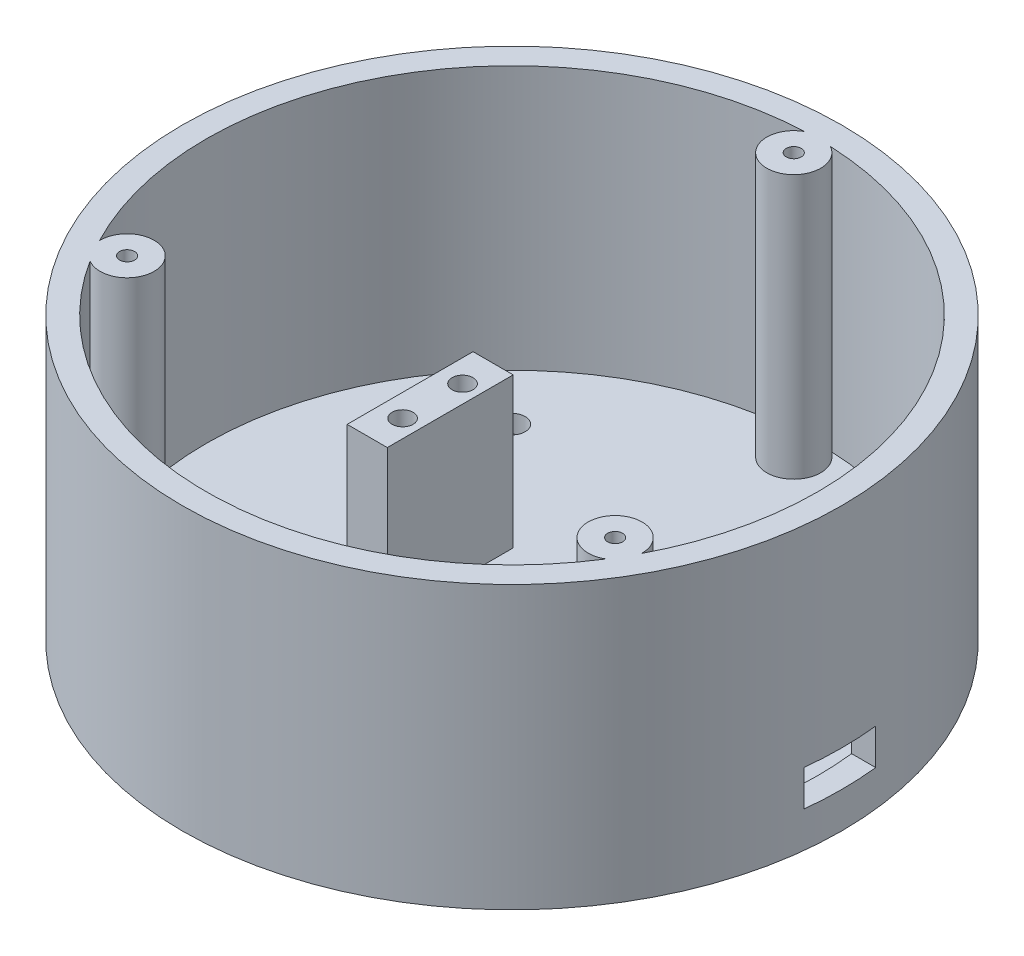
ISO-10303-21;
HEADER;
FILE_DESCRIPTION(('STEP AP214'),'2;1');
FILE_NAME('part.step','',(''),(''),'','','');
FILE_SCHEMA(('AUTOMOTIVE_DESIGN { 1 0 10303 214 1 1 1 1 }'));
ENDSEC;
DATA;
#1=APPLICATION_CONTEXT('core data for automotive mechanical design processes');
#2=APPLICATION_PROTOCOL_DEFINITION('international standard','automotive_design',2000,#1);
#3=PRODUCT_CONTEXT('',#1,'mechanical');
#4=PRODUCT('Part','Part','',(#3));
#5=PRODUCT_RELATED_PRODUCT_CATEGORY('part','',(#4));
#6=PRODUCT_DEFINITION_FORMATION('','',#4);
#7=PRODUCT_DEFINITION_CONTEXT('part definition',#1,'design');
#8=PRODUCT_DEFINITION('design','',#6,#7);
#9=PRODUCT_DEFINITION_SHAPE('','',#8);
#10=(LENGTH_UNIT() NAMED_UNIT(*) SI_UNIT(.MILLI.,.METRE.));
#11=(NAMED_UNIT(*) PLANE_ANGLE_UNIT() SI_UNIT($,.RADIAN.));
#12=(NAMED_UNIT(*) SI_UNIT($,.STERADIAN.) SOLID_ANGLE_UNIT());
#13=UNCERTAINTY_MEASURE_WITH_UNIT(LENGTH_MEASURE(1.E-05),#10,'distance_accuracy_value','');
#14=(GEOMETRIC_REPRESENTATION_CONTEXT(3) GLOBAL_UNCERTAINTY_ASSIGNED_CONTEXT((#13)) GLOBAL_UNIT_ASSIGNED_CONTEXT((#10,
#11,#12)) REPRESENTATION_CONTEXT('',''));
#15=CARTESIAN_POINT('',(0.,0.,0.));
#16=DIRECTION('',(0.,0.,1.));
#17=DIRECTION('',(1.,0.,0.));
#18=AXIS2_PLACEMENT_3D('',#15,#16,#17);
#19=CARTESIAN_POINT('',(0.,3.,0.));
#20=DIRECTION('',(0.,1.,0.));
#21=DIRECTION('',(0.,0.,1.));
#22=AXIS2_PLACEMENT_3D('',#19,#20,#21);
#23=CYLINDRICAL_SURFACE('',#22,51.);
#24=DIRECTION('',(0.,-1.,0.));
#25=VECTOR('',#24,1.);
#26=CARTESIAN_POINT('',(-2.14701139574384,25.,-50.9547872340426));
#27=LINE('',#26,#25);
#28=CARTESIAN_POINT('',(-2.14701139574383,47.,-50.9547872340425));
#29=VERTEX_POINT('',#28);
#30=CARTESIAN_POINT('',(-2.14701139574383,3.,-50.9547872340425));
#31=VERTEX_POINT('',#30);
#32=EDGE_CURVE('E168',#29,#31,#27,.T.);
#33=ORIENTED_EDGE('',*,*,#32,.F.);
#34=CARTESIAN_POINT('',(0.,47.,0.));
#35=DIRECTION('',(0.,1.,0.));
#36=DIRECTION('',(0.,0.,1.));
#37=AXIS2_PLACEMENT_3D('',#34,#35,#36);
#38=CIRCLE('',#37,51.);
#39=CARTESIAN_POINT('',(-45.2016458869845,47.,23.6180272060909));
#40=VERTEX_POINT('',#39);
#41=EDGE_CURVE('E165',#29,#40,#38,.T.);
#42=ORIENTED_EDGE('',*,*,#41,.T.);
#43=DIRECTION('',(0.,-1.,0.));
#44=VECTOR('',#43,1.);
#45=CARTESIAN_POINT('',(-45.2016458869845,25.,23.6180272060909));
#46=LINE('',#45,#44);
#47=CARTESIAN_POINT('',(-45.2016458869846,3.,23.6180272060909));
#48=VERTEX_POINT('',#47);
#49=EDGE_CURVE('E65',#48,#40,#46,.F.);
#50=ORIENTED_EDGE('',*,*,#49,.F.);
#51=CARTESIAN_POINT('',(0.,3.,0.));
#52=DIRECTION('',(0.,1.,0.));
#53=DIRECTION('',(0.,0.,1.));
#54=AXIS2_PLACEMENT_3D('',#51,#52,#53);
#55=CIRCLE('',#54,51.);
#56=EDGE_CURVE('E332',#31,#48,#55,.T.);
#57=ORIENTED_EDGE('',*,*,#56,.F.);
#58=EDGE_LOOP('',(#33,#42,#50,#57));
#59=FACE_BOUND('',#58,.T.);
#60=ADVANCED_FACE('F39',(#59),#23,.F.);
#61=DIRECTION('',(0.,1.,0.));
#62=VECTOR('',#61,1.);
#63=CARTESIAN_POINT('',(50.6458290484024,3.,6.));
#64=LINE('',#63,#62);
#65=CARTESIAN_POINT('',(50.6458290484024,6.,6.));
#66=VERTEX_POINT('',#65);
#67=CARTESIAN_POINT('',(50.6458290484024,12.,6.));
#68=VERTEX_POINT('',#67);
#69=EDGE_CURVE('E11',#66,#68,#64,.T.);
#70=ORIENTED_EDGE('',*,*,#69,.F.);
#71=CARTESIAN_POINT('',(0.,6.,0.));
#72=DIRECTION('',(0.,1.,0.));
#73=DIRECTION('',(0.,0.,1.));
#74=AXIS2_PLACEMENT_3D('',#71,#72,#73);
#75=CIRCLE('',#74,51.);
#76=CARTESIAN_POINT('',(50.6458290484024,6.,-6.));
#77=VERTEX_POINT('',#76);
#78=EDGE_CURVE('E50',#77,#66,#75,.F.);
#79=ORIENTED_EDGE('',*,*,#78,.F.);
#80=DIRECTION('',(0.,1.,0.));
#81=VECTOR('',#80,1.);
#82=CARTESIAN_POINT('',(50.6458290484024,3.,-6.));
#83=LINE('',#82,#81);
#84=CARTESIAN_POINT('',(50.6458290484024,12.,-6.));
#85=VERTEX_POINT('',#84);
#86=EDGE_CURVE('E343',#85,#77,#83,.F.);
#87=ORIENTED_EDGE('',*,*,#86,.F.);
#88=CARTESIAN_POINT('',(0.,12.,0.));
#89=DIRECTION('',(0.,-1.,0.));
#90=DIRECTION('',(0.,0.,-1.));
#91=AXIS2_PLACEMENT_3D('',#88,#89,#90);
#92=CIRCLE('',#91,51.);
#93=EDGE_CURVE('E339',#68,#85,#92,.F.);
#94=ORIENTED_EDGE('',*,*,#93,.F.);
#95=EDGE_LOOP('',(#70,#79,#87,#94));
#96=FACE_BOUND('',#95,.T.);
#97=DIRECTION('',(0.,-1.,0.));
#98=VECTOR('',#97,1.);
#99=CARTESIAN_POINT('',(2.14701139574384,25.,-50.9547872340426));
#100=LINE('',#99,#98);
#101=CARTESIAN_POINT('',(2.14701139574383,3.,-50.9547872340425));
#102=VERTEX_POINT('',#101);
#103=CARTESIAN_POINT('',(2.14701139574384,47.,-50.9547872340426));
#104=VERTEX_POINT('',#103);
#105=EDGE_CURVE('E204',#102,#104,#100,.F.);
#106=ORIENTED_EDGE('',*,*,#105,.F.);
#107=CARTESIAN_POINT('',(45.2016458869877,3.,23.618027206085));
#108=VERTEX_POINT('',#107);
#109=EDGE_CURVE('E335',#108,#102,#55,.T.);
#110=ORIENTED_EDGE('',*,*,#109,.F.);
#111=DIRECTION('',(0.,-1.,0.));
#112=VECTOR('',#111,1.);
#113=CARTESIAN_POINT('',(45.2016458869877,25.,23.618027206085));
#114=LINE('',#113,#112);
#115=CARTESIAN_POINT('',(45.2016458869877,47.,23.618027206085));
#116=VERTEX_POINT('',#115);
#117=EDGE_CURVE('E198',#116,#108,#114,.T.);
#118=ORIENTED_EDGE('',*,*,#117,.F.);
#119=EDGE_CURVE('E171',#116,#104,#38,.T.);
#120=ORIENTED_EDGE('',*,*,#119,.T.);
#121=EDGE_LOOP('',(#106,#110,#118,#120));
#122=FACE_BOUND('',#121,.T.);
#123=ADVANCED_FACE('F360',(#96,#122),#23,.F.);
#124=DIRECTION('',(0.,-1.,0.));
#125=VECTOR('',#124,1.);
#126=CARTESIAN_POINT('',(43.0546344912378,25.,27.3367600279536));
#127=LINE('',#126,#125);
#128=CARTESIAN_POINT('',(43.0546344912378,3.,27.3367600279536));
#129=VERTEX_POINT('',#128);
#130=CARTESIAN_POINT('',(43.0546344912378,47.,27.3367600279536));
#131=VERTEX_POINT('',#130);
#132=EDGE_CURVE('E196',#129,#131,#127,.F.);
#133=ORIENTED_EDGE('',*,*,#132,.F.);
#134=CARTESIAN_POINT('',(-43.0546344912367,3.,27.3367600279552));
#135=VERTEX_POINT('',#134);
#136=EDGE_CURVE('E334',#135,#129,#55,.T.);
#137=ORIENTED_EDGE('',*,*,#136,.F.);
#138=DIRECTION('',(0.,-1.,0.));
#139=VECTOR('',#138,1.);
#140=CARTESIAN_POINT('',(-43.0546344912367,25.,27.3367600279551));
#141=LINE('',#140,#139);
#142=CARTESIAN_POINT('',(-43.0546344912367,47.,27.3367600279552));
#143=VERTEX_POINT('',#142);
#144=EDGE_CURVE('E177',#143,#135,#141,.T.);
#145=ORIENTED_EDGE('',*,*,#144,.F.);
#146=EDGE_CURVE('E175',#143,#131,#38,.T.);
#147=ORIENTED_EDGE('',*,*,#146,.T.);
#148=EDGE_LOOP('',(#133,#137,#145,#147));
#149=FACE_BOUND('',#148,.T.);
#150=ADVANCED_FACE('F382',(#149),#23,.F.);
#151=CARTESIAN_POINT('',(0.,3.,0.));
#152=DIRECTION('',(0.,1.,0.));
#153=DIRECTION('',(0.,0.,1.));
#154=AXIS2_PLACEMENT_3D('',#151,#152,#153);
#155=PLANE('',#154);
#156=DIRECTION('',(-1.,0.,0.));
#157=VECTOR('',#156,1.);
#158=CARTESIAN_POINT('',(-10.3,3.,-10.5));
#159=LINE('',#158,#157);
#160=CARTESIAN_POINT('',(-10.3,3.,-10.5));
#161=VERTEX_POINT('',#160);
#162=CARTESIAN_POINT('',(-17.,3.,-10.5));
#163=VERTEX_POINT('',#162);
#164=EDGE_CURVE('E290',#161,#163,#159,.T.);
#165=ORIENTED_EDGE('',*,*,#164,.F.);
#166=DIRECTION('',(0.,0.,-1.));
#167=VECTOR('',#166,1.);
#168=CARTESIAN_POINT('',(-10.3,3.,-10.5));
#169=LINE('',#168,#167);
#170=CARTESIAN_POINT('',(-10.3,3.,10.5));
#171=VERTEX_POINT('',#170);
#172=EDGE_CURVE('E288',#171,#161,#169,.T.);
#173=ORIENTED_EDGE('',*,*,#172,.F.);
#174=DIRECTION('',(1.,0.,0.));
#175=VECTOR('',#174,1.);
#176=CARTESIAN_POINT('',(-10.3,3.,10.5));
#177=LINE('',#176,#175);
#178=CARTESIAN_POINT('',(-17.,3.,10.5));
#179=VERTEX_POINT('',#178);
#180=EDGE_CURVE('E278',#179,#171,#177,.T.);
#181=ORIENTED_EDGE('',*,*,#180,.F.);
#182=DIRECTION('',(0.,0.,1.));
#183=VECTOR('',#182,1.);
#184=CARTESIAN_POINT('',(-17.,3.,-10.5));
#185=LINE('',#184,#183);
#186=EDGE_CURVE('E292',#163,#179,#185,.T.);
#187=ORIENTED_EDGE('',*,*,#186,.F.);
#188=EDGE_LOOP('',(#165,#173,#181,#187));
#189=FACE_BOUND('',#188,.T.);
#190=DIRECTION('',(1.,0.,0.));
#191=VECTOR('',#190,1.);
#192=CARTESIAN_POINT('',(31.3,3.,10.5));
#193=LINE('',#192,#191);
#194=CARTESIAN_POINT('',(31.3,3.,10.5));
#195=VERTEX_POINT('',#194);
#196=CARTESIAN_POINT('',(38.,3.,10.5));
#197=VERTEX_POINT('',#196);
#198=EDGE_CURVE('E321',#195,#197,#193,.T.);
#199=ORIENTED_EDGE('',*,*,#198,.F.);
#200=DIRECTION('',(0.,0.,1.));
#201=VECTOR('',#200,1.);
#202=CARTESIAN_POINT('',(31.3,3.,-10.5));
#203=LINE('',#202,#201);
#204=CARTESIAN_POINT('',(31.3,3.,-10.5));
#205=VERTEX_POINT('',#204);
#206=EDGE_CURVE('E286',#205,#195,#203,.T.);
#207=ORIENTED_EDGE('',*,*,#206,.F.);
#208=DIRECTION('',(-1.,0.,0.));
#209=VECTOR('',#208,1.);
#210=CARTESIAN_POINT('',(31.3,3.,-10.5));
#211=LINE('',#210,#209);
#212=CARTESIAN_POINT('',(38.,3.,-10.5));
#213=VERTEX_POINT('',#212);
#214=EDGE_CURVE('E314',#213,#205,#211,.T.);
#215=ORIENTED_EDGE('',*,*,#214,.F.);
#216=DIRECTION('',(0.,0.,-1.));
#217=VECTOR('',#216,1.);
#218=CARTESIAN_POINT('',(38.,3.,-10.5));
#219=LINE('',#218,#217);
#220=EDGE_CURVE('E320',#197,#213,#219,.T.);
#221=ORIENTED_EDGE('',*,*,#220,.F.);
#222=EDGE_LOOP('',(#199,#207,#215,#221));
#223=FACE_BOUND('',#222,.T.);
#224=CARTESIAN_POINT('',(-28.28,3.,-28.28));
#225=DIRECTION('',(0.,1.,0.));
#226=DIRECTION('',(0.,0.,1.));
#227=AXIS2_PLACEMENT_3D('',#224,#225,#226);
#228=CIRCLE('',#227,2.2);
#229=CARTESIAN_POINT('',(-28.28,3.,-26.08));
#230=VERTEX_POINT('',#229);
#231=EDGE_CURVE('E208',#230,#230,#228,.T.);
#232=ORIENTED_EDGE('',*,*,#231,.F.);
#233=EDGE_LOOP('',(#232));
#234=FACE_BOUND('',#233,.T.);
#235=CARTESIAN_POINT('',(28.2800000000001,3.,-28.2799999999999));
#236=DIRECTION('',(0.,1.,0.));
#237=DIRECTION('',(0.,0.,1.));
#238=AXIS2_PLACEMENT_3D('',#235,#236,#237);
#239=CIRCLE('',#238,2.2);
#240=CARTESIAN_POINT('',(28.2800000000001,3.,-26.0799999999999));
#241=VERTEX_POINT('',#240);
#242=EDGE_CURVE('E210',#241,#241,#239,.T.);
#243=ORIENTED_EDGE('',*,*,#242,.F.);
#244=EDGE_LOOP('',(#243));
#245=FACE_BOUND('',#244,.T.);
#246=CARTESIAN_POINT('',(28.2799999999997,3.,28.2800000000003));
#247=DIRECTION('',(0.,1.,0.));
#248=DIRECTION('',(0.,0.,1.));
#249=AXIS2_PLACEMENT_3D('',#246,#247,#248);
#250=CIRCLE('',#249,2.19999999999989);
#251=CARTESIAN_POINT('',(28.2799999999997,3.,30.4800000000002));
#252=VERTEX_POINT('',#251);
#253=EDGE_CURVE('E213',#252,#252,#250,.T.);
#254=ORIENTED_EDGE('',*,*,#253,.F.);
#255=EDGE_LOOP('',(#254));
#256=FACE_BOUND('',#255,.T.);
#257=CARTESIAN_POINT('',(-28.2800000000003,3.,28.2799999999997));
#258=DIRECTION('',(0.,1.,0.));
#259=DIRECTION('',(0.,0.,1.));
#260=AXIS2_PLACEMENT_3D('',#257,#258,#259);
#261=CIRCLE('',#260,2.2);
#262=CARTESIAN_POINT('',(-28.2800000000003,3.,30.4799999999997));
#263=VERTEX_POINT('',#262);
#264=EDGE_CURVE('E219',#263,#263,#261,.T.);
#265=ORIENTED_EDGE('',*,*,#264,.F.);
#266=EDGE_LOOP('',(#265));
#267=FACE_BOUND('',#266,.T.);
#268=CARTESIAN_POINT('',(0.,3.,-47.));
#269=DIRECTION('',(0.,1.,0.));
#270=DIRECTION('',(0.,0.,1.));
#271=AXIS2_PLACEMENT_3D('',#268,#269,#270);
#272=CIRCLE('',#271,4.5);
#273=EDGE_CURVE('E401',#31,#102,#272,.T.);
#274=ORIENTED_EDGE('',*,*,#273,.F.);
#275=ORIENTED_EDGE('',*,*,#56,.T.);
#276=CARTESIAN_POINT('',(-40.7031939778666,3.,23.5000000000011));
#277=DIRECTION('',(0.,1.,0.));
#278=DIRECTION('',(0.,0.,1.));
#279=AXIS2_PLACEMENT_3D('',#276,#277,#278);
#280=CIRCLE('',#279,4.50000000000264);
#281=EDGE_CURVE('E53',#135,#48,#280,.T.);
#282=ORIENTED_EDGE('',*,*,#281,.F.);
#283=ORIENTED_EDGE('',*,*,#136,.T.);
#284=CARTESIAN_POINT('',(40.7031939778706,3.,23.4999999999988));
#285=DIRECTION('',(0.,1.,0.));
#286=DIRECTION('',(0.,0.,1.));
#287=AXIS2_PLACEMENT_3D('',#284,#285,#286);
#288=CIRCLE('',#287,4.50000000000178);
#289=EDGE_CURVE('E396',#108,#129,#288,.T.);
#290=ORIENTED_EDGE('',*,*,#289,.F.);
#291=ORIENTED_EDGE('',*,*,#109,.T.);
#292=EDGE_LOOP('',(#274,#275,#282,#283,#290,#291));
#293=FACE_BOUND('',#292,.T.);
#294=ADVANCED_FACE('F369',(#189,#223,#234,#245,#256,#267,#293),#155,.T.);
#295=CARTESIAN_POINT('',(0.,47.,0.));
#296=DIRECTION('',(0.,-1.,0.));
#297=DIRECTION('',(0.,0.,-1.));
#298=AXIS2_PLACEMENT_3D('',#295,#296,#297);
#299=CYLINDRICAL_SURFACE('',#298,55.);
#300=CARTESIAN_POINT('',(0.,0.,0.));
#301=DIRECTION('',(0.,1.,0.));
#302=DIRECTION('',(0.,0.,1.));
#303=AXIS2_PLACEMENT_3D('',#300,#301,#302);
#304=CIRCLE('',#303,55.);
#305=CARTESIAN_POINT('',(0.,0.,55.));
#306=VERTEX_POINT('',#305);
#307=EDGE_CURVE('E338',#306,#306,#304,.T.);
#308=ORIENTED_EDGE('',*,*,#307,.T.);
#309=EDGE_LOOP('',(#308));
#310=FACE_BOUND('',#309,.T.);
#311=CARTESIAN_POINT('',(0.,47.,0.));
#312=DIRECTION('',(0.,1.,0.));
#313=DIRECTION('',(0.,0.,1.));
#314=AXIS2_PLACEMENT_3D('',#311,#312,#313);
#315=CIRCLE('',#314,55.);
#316=CARTESIAN_POINT('',(0.,47.,55.));
#317=VERTEX_POINT('',#316);
#318=EDGE_CURVE('E337',#317,#317,#315,.T.);
#319=ORIENTED_EDGE('',*,*,#318,.F.);
#320=EDGE_LOOP('',(#319));
#321=FACE_BOUND('',#320,.T.);
#322=DIRECTION('',(0.,-1.,0.));
#323=VECTOR('',#322,1.);
#324=CARTESIAN_POINT('',(54.6717477313466,47.,6.00000000000001));
#325=LINE('',#324,#323);
#326=CARTESIAN_POINT('',(54.6717477313466,12.,6.));
#327=VERTEX_POINT('',#326);
#328=CARTESIAN_POINT('',(54.6717477313466,6.00000000000001,6.));
#329=VERTEX_POINT('',#328);
#330=EDGE_CURVE('E247',#327,#329,#325,.T.);
#331=ORIENTED_EDGE('',*,*,#330,.F.);
#332=CARTESIAN_POINT('',(0.,12.,0.));
#333=DIRECTION('',(0.,-1.,0.));
#334=DIRECTION('',(0.,0.,-1.));
#335=AXIS2_PLACEMENT_3D('',#332,#333,#334);
#336=CIRCLE('',#335,55.);
#337=CARTESIAN_POINT('',(54.6717477313466,12.,-6.));
#338=VERTEX_POINT('',#337);
#339=EDGE_CURVE('E241',#338,#327,#336,.T.);
#340=ORIENTED_EDGE('',*,*,#339,.F.);
#341=DIRECTION('',(0.,-1.,0.));
#342=VECTOR('',#341,1.);
#343=CARTESIAN_POINT('',(54.6717477313466,47.,-5.99999999999999));
#344=LINE('',#343,#342);
#345=CARTESIAN_POINT('',(54.6717477313466,6.,-6.));
#346=VERTEX_POINT('',#345);
#347=EDGE_CURVE('E243',#346,#338,#344,.F.);
#348=ORIENTED_EDGE('',*,*,#347,.F.);
#349=CARTESIAN_POINT('',(0.,6.00000000000001,0.));
#350=DIRECTION('',(0.,1.,0.));
#351=DIRECTION('',(0.,0.,1.));
#352=AXIS2_PLACEMENT_3D('',#349,#350,#351);
#353=CIRCLE('',#352,55.);
#354=EDGE_CURVE('E246',#329,#346,#353,.T.);
#355=ORIENTED_EDGE('',*,*,#354,.F.);
#356=EDGE_LOOP('',(#331,#340,#348,#355));
#357=FACE_BOUND('',#356,.T.);
#358=ADVANCED_FACE('F41',(#310,#321,#357),#299,.T.);
#359=CARTESIAN_POINT('',(0.,28.,0.));
#360=DIRECTION('',(0.,1.,0.));
#361=DIRECTION('',(0.,0.,1.));
#362=AXIS2_PLACEMENT_3D('',#359,#360,#361);
#363=PLANE('',#362);
#364=DIRECTION('',(0.,0.,1.));
#365=VECTOR('',#364,1.);
#366=CARTESIAN_POINT('',(31.3,28.,-10.5));
#367=LINE('',#366,#365);
#368=CARTESIAN_POINT('',(31.3,28.,-10.5));
#369=VERTEX_POINT('',#368);
#370=CARTESIAN_POINT('',(31.3,28.,10.5));
#371=VERTEX_POINT('',#370);
#372=EDGE_CURVE('E319',#369,#371,#367,.T.);
#373=ORIENTED_EDGE('',*,*,#372,.T.);
#374=DIRECTION('',(1.,0.,0.));
#375=VECTOR('',#374,1.);
#376=CARTESIAN_POINT('',(31.3,28.,10.5));
#377=LINE('',#376,#375);
#378=CARTESIAN_POINT('',(38.,28.,10.5));
#379=VERTEX_POINT('',#378);
#380=EDGE_CURVE('E327',#371,#379,#377,.T.);
#381=ORIENTED_EDGE('',*,*,#380,.T.);
#382=DIRECTION('',(0.,0.,-1.));
#383=VECTOR('',#382,1.);
#384=CARTESIAN_POINT('',(38.,28.,-10.5));
#385=LINE('',#384,#383);
#386=CARTESIAN_POINT('',(38.,28.,-10.5));
#387=VERTEX_POINT('',#386);
#388=EDGE_CURVE('E326',#379,#387,#385,.T.);
#389=ORIENTED_EDGE('',*,*,#388,.T.);
#390=DIRECTION('',(-1.,0.,0.));
#391=VECTOR('',#390,1.);
#392=CARTESIAN_POINT('',(31.3,28.,-10.5));
#393=LINE('',#392,#391);
#394=EDGE_CURVE('E313',#387,#369,#393,.T.);
#395=ORIENTED_EDGE('',*,*,#394,.T.);
#396=EDGE_LOOP('',(#373,#381,#389,#395));
#397=FACE_BOUND('',#396,.T.);
#398=CARTESIAN_POINT('',(34.25,28.,-5.));
#399=DIRECTION('',(0.,1.,0.));
#400=DIRECTION('',(0.,0.,1.));
#401=AXIS2_PLACEMENT_3D('',#398,#399,#400);
#402=CIRCLE('',#401,1.75);
#403=CARTESIAN_POINT('',(34.25,28.,-3.24999999999999));
#404=VERTEX_POINT('',#403);
#405=EDGE_CURVE('E251',#404,#404,#402,.T.);
#406=ORIENTED_EDGE('',*,*,#405,.F.);
#407=EDGE_LOOP('',(#406));
#408=FACE_BOUND('',#407,.T.);
#409=CARTESIAN_POINT('',(34.25,28.,5.));
#410=DIRECTION('',(0.,-1.,0.));
#411=DIRECTION('',(0.,0.,-1.));
#412=AXIS2_PLACEMENT_3D('',#409,#410,#411);
#413=CIRCLE('',#412,1.75);
#414=CARTESIAN_POINT('',(34.25,28.,3.24999999999999));
#415=VERTEX_POINT('',#414);
#416=EDGE_CURVE('E252',#415,#415,#413,.T.);
#417=ORIENTED_EDGE('',*,*,#416,.T.);
#418=EDGE_LOOP('',(#417));
#419=FACE_BOUND('',#418,.T.);
#420=ADVANCED_FACE('F367',(#397,#408,#419),#363,.T.);
#421=CARTESIAN_POINT('',(0.,28.,0.));
#422=DIRECTION('',(0.,-1.,0.));
#423=DIRECTION('',(0.,0.,-1.));
#424=AXIS2_PLACEMENT_3D('',#421,#422,#423);
#425=PLANE('',#424);
#426=DIRECTION('',(0.,0.,-1.));
#427=VECTOR('',#426,1.);
#428=CARTESIAN_POINT('',(-10.3,28.,-10.5));
#429=LINE('',#428,#427);
#430=CARTESIAN_POINT('',(-10.3,28.,10.5));
#431=VERTEX_POINT('',#430);
#432=CARTESIAN_POINT('',(-10.3,28.,-10.5));
#433=VERTEX_POINT('',#432);
#434=EDGE_CURVE('E273',#431,#433,#429,.T.);
#435=ORIENTED_EDGE('',*,*,#434,.T.);
#436=DIRECTION('',(-1.,0.,0.));
#437=VECTOR('',#436,1.);
#438=CARTESIAN_POINT('',(-10.3,28.,-10.5));
#439=LINE('',#438,#437);
#440=CARTESIAN_POINT('',(-17.,28.,-10.5));
#441=VERTEX_POINT('',#440);
#442=EDGE_CURVE('E277',#433,#441,#439,.T.);
#443=ORIENTED_EDGE('',*,*,#442,.T.);
#444=DIRECTION('',(0.,0.,1.));
#445=VECTOR('',#444,1.);
#446=CARTESIAN_POINT('',(-17.,28.,-10.5));
#447=LINE('',#446,#445);
#448=CARTESIAN_POINT('',(-17.,28.,10.5));
#449=VERTEX_POINT('',#448);
#450=EDGE_CURVE('E281',#441,#449,#447,.T.);
#451=ORIENTED_EDGE('',*,*,#450,.T.);
#452=DIRECTION('',(1.,0.,0.));
#453=VECTOR('',#452,1.);
#454=CARTESIAN_POINT('',(-10.3,28.,10.5));
#455=LINE('',#454,#453);
#456=EDGE_CURVE('E282',#449,#431,#455,.T.);
#457=ORIENTED_EDGE('',*,*,#456,.T.);
#458=EDGE_LOOP('',(#435,#443,#451,#457));
#459=FACE_BOUND('',#458,.T.);
#460=CARTESIAN_POINT('',(-13.25,28.,5.));
#461=DIRECTION('',(0.,-1.,0.));
#462=DIRECTION('',(0.,0.,-1.));
#463=AXIS2_PLACEMENT_3D('',#460,#461,#462);
#464=CIRCLE('',#463,1.75);
#465=CARTESIAN_POINT('',(-13.25,28.,3.25));
#466=VERTEX_POINT('',#465);
#467=EDGE_CURVE('E257',#466,#466,#464,.T.);
#468=ORIENTED_EDGE('',*,*,#467,.T.);
#469=EDGE_LOOP('',(#468));
#470=FACE_BOUND('',#469,.T.);
#471=CARTESIAN_POINT('',(-13.25,28.,-5.));
#472=DIRECTION('',(0.,1.,0.));
#473=DIRECTION('',(0.,0.,1.));
#474=AXIS2_PLACEMENT_3D('',#471,#472,#473);
#475=CIRCLE('',#474,1.75);
#476=CARTESIAN_POINT('',(-13.25,28.,-3.25));
#477=VERTEX_POINT('',#476);
#478=EDGE_CURVE('E263',#477,#477,#475,.T.);
#479=ORIENTED_EDGE('',*,*,#478,.F.);
#480=EDGE_LOOP('',(#479));
#481=FACE_BOUND('',#480,.T.);
#482=ADVANCED_FACE('F380',(#459,#470,#481),#425,.F.);
#483=CARTESIAN_POINT('',(0.,47.,0.));
#484=DIRECTION('',(0.,1.,0.));
#485=DIRECTION('',(0.,0.,1.));
#486=AXIS2_PLACEMENT_3D('',#483,#484,#485);
#487=PLANE('',#486);
#488=CARTESIAN_POINT('',(0.,47.,-47.));
#489=DIRECTION('',(0.,1.,0.));
#490=DIRECTION('',(0.,0.,1.));
#491=AXIS2_PLACEMENT_3D('',#488,#489,#490);
#492=CIRCLE('',#491,1.25);
#493=CARTESIAN_POINT('',(0.,47.,-45.75));
#494=VERTEX_POINT('',#493);
#495=EDGE_CURVE('E191',#494,#494,#492,.T.);
#496=ORIENTED_EDGE('',*,*,#495,.F.);
#497=EDGE_LOOP('',(#496));
#498=FACE_BOUND('',#497,.T.);
#499=CARTESIAN_POINT('',(40.703193977873,47.,23.4999999999974));
#500=DIRECTION('',(0.,1.,0.));
#501=DIRECTION('',(0.,0.,1.));
#502=AXIS2_PLACEMENT_3D('',#499,#500,#501);
#503=CIRCLE('',#502,1.25000000000369);
#504=CARTESIAN_POINT('',(40.703193977873,47.,24.7500000000011));
#505=VERTEX_POINT('',#504);
#506=EDGE_CURVE('E417',#505,#505,#503,.T.);
#507=ORIENTED_EDGE('',*,*,#506,.F.);
#508=EDGE_LOOP('',(#507));
#509=FACE_BOUND('',#508,.T.);
#510=CARTESIAN_POINT('',(-40.7031939778642,47.,23.5000000000025));
#511=DIRECTION('',(0.,1.,0.));
#512=DIRECTION('',(0.,0.,1.));
#513=AXIS2_PLACEMENT_3D('',#510,#511,#512);
#514=CIRCLE('',#513,1.25000000000533);
#515=CARTESIAN_POINT('',(-40.7031939778642,47.,24.7500000000079));
#516=VERTEX_POINT('',#515);
#517=EDGE_CURVE('E415',#516,#516,#514,.T.);
#518=ORIENTED_EDGE('',*,*,#517,.F.);
#519=EDGE_LOOP('',(#518));
#520=FACE_BOUND('',#519,.T.);
#521=ORIENTED_EDGE('',*,*,#146,.F.);
#522=CARTESIAN_POINT('',(-40.7031939778666,47.,23.5000000000011));
#523=DIRECTION('',(0.,1.,0.));
#524=DIRECTION('',(0.,0.,1.));
#525=AXIS2_PLACEMENT_3D('',#522,#523,#524);
#526=CIRCLE('',#525,4.50000000000264);
#527=EDGE_CURVE('E178',#143,#40,#526,.T.);
#528=ORIENTED_EDGE('',*,*,#527,.T.);
#529=ORIENTED_EDGE('',*,*,#41,.F.);
#530=CARTESIAN_POINT('',(0.,47.,-47.));
#531=DIRECTION('',(0.,1.,0.));
#532=DIRECTION('',(0.,0.,1.));
#533=AXIS2_PLACEMENT_3D('',#530,#531,#532);
#534=CIRCLE('',#533,4.5);
#535=EDGE_CURVE('E179',#29,#104,#534,.T.);
#536=ORIENTED_EDGE('',*,*,#535,.T.);
#537=ORIENTED_EDGE('',*,*,#119,.F.);
#538=CARTESIAN_POINT('',(40.7031939778706,47.,23.4999999999988));
#539=DIRECTION('',(0.,1.,0.));
#540=DIRECTION('',(0.,0.,1.));
#541=AXIS2_PLACEMENT_3D('',#538,#539,#540);
#542=CIRCLE('',#541,4.50000000000178);
#543=EDGE_CURVE('E189',#116,#131,#542,.T.);
#544=ORIENTED_EDGE('',*,*,#543,.T.);
#545=EDGE_LOOP('',(#521,#528,#529,#536,#537,#544));
#546=FACE_BOUND('',#545,.T.);
#547=ORIENTED_EDGE('',*,*,#318,.T.);
#548=EDGE_LOOP('',(#547));
#549=FACE_BOUND('',#548,.T.);
#550=ADVANCED_FACE('F182',(#498,#509,#520,#546,#549),#487,.T.);
#551=CARTESIAN_POINT('',(0.,0.,0.));
#552=DIRECTION('',(0.,1.,0.));
#553=DIRECTION('',(0.,0.,1.));
#554=AXIS2_PLACEMENT_3D('',#551,#552,#553);
#555=PLANE('',#554);
#556=CARTESIAN_POINT('',(-28.2800000000003,0.,28.2799999999997));
#557=DIRECTION('',(0.,1.,0.));
#558=DIRECTION('',(0.,0.,1.));
#559=AXIS2_PLACEMENT_3D('',#556,#557,#558);
#560=CIRCLE('',#559,2.2);
#561=CARTESIAN_POINT('',(-28.2800000000003,0.,30.4799999999997));
#562=VERTEX_POINT('',#561);
#563=EDGE_CURVE('E207',#562,#562,#560,.T.);
#564=ORIENTED_EDGE('',*,*,#563,.T.);
#565=EDGE_LOOP('',(#564));
#566=FACE_BOUND('',#565,.T.);
#567=CARTESIAN_POINT('',(28.2799999999997,0.,28.2800000000003));
#568=DIRECTION('',(0.,1.,0.));
#569=DIRECTION('',(0.,0.,1.));
#570=AXIS2_PLACEMENT_3D('',#567,#568,#569);
#571=CIRCLE('',#570,2.19999999999989);
#572=CARTESIAN_POINT('',(28.2799999999997,0.,30.4800000000002));
#573=VERTEX_POINT('',#572);
#574=EDGE_CURVE('E220',#573,#573,#571,.T.);
#575=ORIENTED_EDGE('',*,*,#574,.T.);
#576=EDGE_LOOP('',(#575));
#577=FACE_BOUND('',#576,.T.);
#578=CARTESIAN_POINT('',(28.2800000000001,0.,-28.2799999999999));
#579=DIRECTION('',(0.,1.,0.));
#580=DIRECTION('',(0.,0.,1.));
#581=AXIS2_PLACEMENT_3D('',#578,#579,#580);
#582=CIRCLE('',#581,2.2);
#583=CARTESIAN_POINT('',(28.2800000000001,0.,-26.0799999999999));
#584=VERTEX_POINT('',#583);
#585=EDGE_CURVE('E211',#584,#584,#582,.T.);
#586=ORIENTED_EDGE('',*,*,#585,.T.);
#587=EDGE_LOOP('',(#586));
#588=FACE_BOUND('',#587,.T.);
#589=CARTESIAN_POINT('',(-28.28,0.,-28.28));
#590=DIRECTION('',(0.,1.,0.));
#591=DIRECTION('',(0.,0.,1.));
#592=AXIS2_PLACEMENT_3D('',#589,#590,#591);
#593=CIRCLE('',#592,2.2);
#594=CARTESIAN_POINT('',(-28.28,0.,-26.08));
#595=VERTEX_POINT('',#594);
#596=EDGE_CURVE('E221',#595,#595,#593,.T.);
#597=ORIENTED_EDGE('',*,*,#596,.T.);
#598=EDGE_LOOP('',(#597));
#599=FACE_BOUND('',#598,.T.);
#600=ORIENTED_EDGE('',*,*,#307,.F.);
#601=EDGE_LOOP('',(#600));
#602=FACE_BOUND('',#601,.T.);
#603=ADVANCED_FACE('F426',(#566,#577,#588,#599,#602),#555,.F.);
#604=CARTESIAN_POINT('',(31.3,28.,-10.5));
#605=DIRECTION('',(1.,0.,0.));
#606=DIRECTION('',(0.,0.,-1.));
#607=AXIS2_PLACEMENT_3D('',#604,#605,#606);
#608=PLANE('',#607);
#609=ORIENTED_EDGE('',*,*,#206,.T.);
#610=DIRECTION('',(0.,-1.,0.));
#611=VECTOR('',#610,1.);
#612=CARTESIAN_POINT('',(31.3,28.,10.5));
#613=LINE('',#612,#611);
#614=EDGE_CURVE('E275',#371,#195,#613,.T.);
#615=ORIENTED_EDGE('',*,*,#614,.F.);
#616=ORIENTED_EDGE('',*,*,#372,.F.);
#617=DIRECTION('',(0.,-1.,0.));
#618=VECTOR('',#617,1.);
#619=CARTESIAN_POINT('',(31.3,28.,-10.5));
#620=LINE('',#619,#618);
#621=EDGE_CURVE('E311',#369,#205,#620,.T.);
#622=ORIENTED_EDGE('',*,*,#621,.T.);
#623=EDGE_LOOP('',(#609,#615,#616,#622));
#624=FACE_BOUND('',#623,.T.);
#625=ADVANCED_FACE('F526',(#624),#608,.F.);
#626=CARTESIAN_POINT('',(31.3,28.,10.5));
#627=DIRECTION('',(0.,0.,-1.));
#628=DIRECTION('',(-1.,0.,0.));
#629=AXIS2_PLACEMENT_3D('',#626,#627,#628);
#630=PLANE('',#629);
#631=ORIENTED_EDGE('',*,*,#198,.T.);
#632=DIRECTION('',(0.,-1.,0.));
#633=VECTOR('',#632,1.);
#634=CARTESIAN_POINT('',(38.,28.,10.5));
#635=LINE('',#634,#633);
#636=EDGE_CURVE('E306',#379,#197,#635,.T.);
#637=ORIENTED_EDGE('',*,*,#636,.F.);
#638=ORIENTED_EDGE('',*,*,#380,.F.);
#639=ORIENTED_EDGE('',*,*,#614,.T.);
#640=EDGE_LOOP('',(#631,#637,#638,#639));
#641=FACE_BOUND('',#640,.T.);
#642=ADVANCED_FACE('F531',(#641),#630,.F.);
#643=CARTESIAN_POINT('',(38.,28.,-10.5));
#644=DIRECTION('',(-1.,0.,0.));
#645=DIRECTION('',(0.,0.,1.));
#646=AXIS2_PLACEMENT_3D('',#643,#644,#645);
#647=PLANE('',#646);
#648=ORIENTED_EDGE('',*,*,#220,.T.);
#649=DIRECTION('',(0.,-1.,0.));
#650=VECTOR('',#649,1.);
#651=CARTESIAN_POINT('',(38.,28.,-10.5));
#652=LINE('',#651,#650);
#653=EDGE_CURVE('E307',#387,#213,#652,.T.);
#654=ORIENTED_EDGE('',*,*,#653,.F.);
#655=ORIENTED_EDGE('',*,*,#388,.F.);
#656=ORIENTED_EDGE('',*,*,#636,.T.);
#657=EDGE_LOOP('',(#648,#654,#655,#656));
#658=FACE_BOUND('',#657,.T.);
#659=ADVANCED_FACE('F540',(#658),#647,.F.);
#660=CARTESIAN_POINT('',(31.3,28.,-10.5));
#661=DIRECTION('',(0.,0.,1.));
#662=DIRECTION('',(1.,0.,0.));
#663=AXIS2_PLACEMENT_3D('',#660,#661,#662);
#664=PLANE('',#663);
#665=ORIENTED_EDGE('',*,*,#214,.T.);
#666=ORIENTED_EDGE('',*,*,#621,.F.);
#667=ORIENTED_EDGE('',*,*,#394,.F.);
#668=ORIENTED_EDGE('',*,*,#653,.T.);
#669=EDGE_LOOP('',(#665,#666,#667,#668));
#670=FACE_BOUND('',#669,.T.);
#671=ADVANCED_FACE('F527',(#670),#664,.F.);
#672=CARTESIAN_POINT('',(-10.3,28.,-10.5));
#673=DIRECTION('',(-1.,0.,0.));
#674=DIRECTION('',(0.,0.,1.));
#675=AXIS2_PLACEMENT_3D('',#672,#673,#674);
#676=PLANE('',#675);
#677=ORIENTED_EDGE('',*,*,#172,.T.);
#678=DIRECTION('',(0.,-1.,0.));
#679=VECTOR('',#678,1.);
#680=CARTESIAN_POINT('',(-10.3,28.,-10.5));
#681=LINE('',#680,#679);
#682=EDGE_CURVE('E303',#433,#161,#681,.T.);
#683=ORIENTED_EDGE('',*,*,#682,.F.);
#684=ORIENTED_EDGE('',*,*,#434,.F.);
#685=DIRECTION('',(0.,-1.,0.));
#686=VECTOR('',#685,1.);
#687=CARTESIAN_POINT('',(-10.3,28.,10.5));
#688=LINE('',#687,#686);
#689=EDGE_CURVE('E284',#431,#171,#688,.T.);
#690=ORIENTED_EDGE('',*,*,#689,.T.);
#691=EDGE_LOOP('',(#677,#683,#684,#690));
#692=FACE_BOUND('',#691,.T.);
#693=ADVANCED_FACE('F523',(#692),#676,.F.);
#694=CARTESIAN_POINT('',(-10.3,28.,-10.5));
#695=DIRECTION('',(0.,0.,1.));
#696=DIRECTION('',(1.,0.,0.));
#697=AXIS2_PLACEMENT_3D('',#694,#695,#696);
#698=PLANE('',#697);
#699=ORIENTED_EDGE('',*,*,#164,.T.);
#700=DIRECTION('',(0.,-1.,0.));
#701=VECTOR('',#700,1.);
#702=CARTESIAN_POINT('',(-17.,28.,-10.5));
#703=LINE('',#702,#701);
#704=EDGE_CURVE('E297',#441,#163,#703,.T.);
#705=ORIENTED_EDGE('',*,*,#704,.F.);
#706=ORIENTED_EDGE('',*,*,#442,.F.);
#707=ORIENTED_EDGE('',*,*,#682,.T.);
#708=EDGE_LOOP('',(#699,#705,#706,#707));
#709=FACE_BOUND('',#708,.T.);
#710=ADVANCED_FACE('F519',(#709),#698,.F.);
#711=CARTESIAN_POINT('',(-17.,28.,-10.5));
#712=DIRECTION('',(1.,0.,0.));
#713=DIRECTION('',(0.,0.,-1.));
#714=AXIS2_PLACEMENT_3D('',#711,#712,#713);
#715=PLANE('',#714);
#716=ORIENTED_EDGE('',*,*,#186,.T.);
#717=DIRECTION('',(0.,-1.,0.));
#718=VECTOR('',#717,1.);
#719=CARTESIAN_POINT('',(-17.,28.,10.5));
#720=LINE('',#719,#718);
#721=EDGE_CURVE('E296',#449,#179,#720,.T.);
#722=ORIENTED_EDGE('',*,*,#721,.F.);
#723=ORIENTED_EDGE('',*,*,#450,.F.);
#724=ORIENTED_EDGE('',*,*,#704,.T.);
#725=EDGE_LOOP('',(#716,#722,#723,#724));
#726=FACE_BOUND('',#725,.T.);
#727=ADVANCED_FACE('F516',(#726),#715,.F.);
#728=CARTESIAN_POINT('',(-10.3,28.,10.5));
#729=DIRECTION('',(0.,0.,-1.));
#730=DIRECTION('',(-1.,0.,0.));
#731=AXIS2_PLACEMENT_3D('',#728,#729,#730);
#732=PLANE('',#731);
#733=ORIENTED_EDGE('',*,*,#180,.T.);
#734=ORIENTED_EDGE('',*,*,#689,.F.);
#735=ORIENTED_EDGE('',*,*,#456,.F.);
#736=ORIENTED_EDGE('',*,*,#721,.T.);
#737=EDGE_LOOP('',(#733,#734,#735,#736));
#738=FACE_BOUND('',#737,.T.);
#739=ADVANCED_FACE('F493',(#738),#732,.F.);
#740=CARTESIAN_POINT('',(-13.25,16.,5.));
#741=DIRECTION('',(0.,1.,0.));
#742=DIRECTION('',(0.,0.,1.));
#743=AXIS2_PLACEMENT_3D('',#740,#741,#742);
#744=CYLINDRICAL_SURFACE('',#743,1.75);
#745=CARTESIAN_POINT('',(-13.25,16.,5.));
#746=DIRECTION('',(0.,-1.,0.));
#747=DIRECTION('',(0.,0.,-1.));
#748=AXIS2_PLACEMENT_3D('',#745,#746,#747);
#749=CIRCLE('',#748,1.75);
#750=CARTESIAN_POINT('',(-13.25,16.,3.25));
#751=VERTEX_POINT('',#750);
#752=EDGE_CURVE('E261',#751,#751,#749,.T.);
#753=ORIENTED_EDGE('',*,*,#752,.T.);
#754=EDGE_LOOP('',(#753));
#755=FACE_BOUND('',#754,.T.);
#756=ORIENTED_EDGE('',*,*,#467,.F.);
#757=EDGE_LOOP('',(#756));
#758=FACE_BOUND('',#757,.T.);
#759=ADVANCED_FACE('F487',(#755,#758),#744,.F.);
#760=CARTESIAN_POINT('',(-13.25,16.,5.));
#761=DIRECTION('',(0.,-1.,0.));
#762=DIRECTION('',(0.,0.,-1.));
#763=AXIS2_PLACEMENT_3D('',#760,#761,#762);
#764=PLANE('',#763);
#765=ORIENTED_EDGE('',*,*,#752,.F.);
#766=EDGE_LOOP('',(#765));
#767=FACE_BOUND('',#766,.T.);
#768=ADVANCED_FACE('F489',(#767),#764,.F.);
#769=CARTESIAN_POINT('',(-13.25,16.,-5.));
#770=DIRECTION('',(0.,1.,0.));
#771=DIRECTION('',(0.,0.,1.));
#772=AXIS2_PLACEMENT_3D('',#769,#770,#771);
#773=CYLINDRICAL_SURFACE('',#772,1.75);
#774=CARTESIAN_POINT('',(-13.25,16.,-5.));
#775=DIRECTION('',(0.,1.,0.));
#776=DIRECTION('',(0.,0.,1.));
#777=AXIS2_PLACEMENT_3D('',#774,#775,#776);
#778=CIRCLE('',#777,1.75);
#779=CARTESIAN_POINT('',(-13.25,16.,-3.25));
#780=VERTEX_POINT('',#779);
#781=EDGE_CURVE('E249',#780,#780,#778,.T.);
#782=ORIENTED_EDGE('',*,*,#781,.F.);
#783=EDGE_LOOP('',(#782));
#784=FACE_BOUND('',#783,.T.);
#785=ORIENTED_EDGE('',*,*,#478,.T.);
#786=EDGE_LOOP('',(#785));
#787=FACE_BOUND('',#786,.T.);
#788=ADVANCED_FACE('F492',(#784,#787),#773,.F.);
#789=CARTESIAN_POINT('',(-13.25,16.,-5.));
#790=DIRECTION('',(0.,1.,0.));
#791=DIRECTION('',(0.,0.,1.));
#792=AXIS2_PLACEMENT_3D('',#789,#790,#791);
#793=PLANE('',#792);
#794=ORIENTED_EDGE('',*,*,#781,.T.);
#795=EDGE_LOOP('',(#794));
#796=FACE_BOUND('',#795,.T.);
#797=ADVANCED_FACE('F497',(#796),#793,.T.);
#798=CARTESIAN_POINT('',(34.25,16.,-5.));
#799=DIRECTION('',(0.,1.,0.));
#800=DIRECTION('',(0.,0.,1.));
#801=AXIS2_PLACEMENT_3D('',#798,#799,#800);
#802=CYLINDRICAL_SURFACE('',#801,1.75);
#803=CARTESIAN_POINT('',(34.25,16.,-5.));
#804=DIRECTION('',(0.,1.,0.));
#805=DIRECTION('',(0.,0.,1.));
#806=AXIS2_PLACEMENT_3D('',#803,#804,#805);
#807=CIRCLE('',#806,1.75);
#808=CARTESIAN_POINT('',(34.25,16.,-3.24999999999999));
#809=VERTEX_POINT('',#808);
#810=EDGE_CURVE('E270',#809,#809,#807,.T.);
#811=ORIENTED_EDGE('',*,*,#810,.F.);
#812=EDGE_LOOP('',(#811));
#813=FACE_BOUND('',#812,.T.);
#814=ORIENTED_EDGE('',*,*,#405,.T.);
#815=EDGE_LOOP('',(#814));
#816=FACE_BOUND('',#815,.T.);
#817=ADVANCED_FACE('F503',(#813,#816),#802,.F.);
#818=CARTESIAN_POINT('',(34.25,16.,-5.));
#819=DIRECTION('',(0.,1.,0.));
#820=DIRECTION('',(0.,0.,1.));
#821=AXIS2_PLACEMENT_3D('',#818,#819,#820);
#822=PLANE('',#821);
#823=ORIENTED_EDGE('',*,*,#810,.T.);
#824=EDGE_LOOP('',(#823));
#825=FACE_BOUND('',#824,.T.);
#826=ADVANCED_FACE('F482',(#825),#822,.T.);
#827=CARTESIAN_POINT('',(34.25,16.,5.));
#828=DIRECTION('',(0.,1.,0.));
#829=DIRECTION('',(0.,0.,1.));
#830=AXIS2_PLACEMENT_3D('',#827,#828,#829);
#831=CYLINDRICAL_SURFACE('',#830,1.75);
#832=CARTESIAN_POINT('',(34.25,16.,5.));
#833=DIRECTION('',(0.,-1.,0.));
#834=DIRECTION('',(0.,0.,-1.));
#835=AXIS2_PLACEMENT_3D('',#832,#833,#834);
#836=CIRCLE('',#835,1.75);
#837=CARTESIAN_POINT('',(34.25,16.,3.24999999999999));
#838=VERTEX_POINT('',#837);
#839=EDGE_CURVE('E253',#838,#838,#836,.T.);
#840=ORIENTED_EDGE('',*,*,#839,.T.);
#841=EDGE_LOOP('',(#840));
#842=FACE_BOUND('',#841,.T.);
#843=ORIENTED_EDGE('',*,*,#416,.F.);
#844=EDGE_LOOP('',(#843));
#845=FACE_BOUND('',#844,.T.);
#846=ADVANCED_FACE('F479',(#842,#845),#831,.F.);
#847=CARTESIAN_POINT('',(34.25,16.,5.));
#848=DIRECTION('',(0.,-1.,0.));
#849=DIRECTION('',(0.,0.,-1.));
#850=AXIS2_PLACEMENT_3D('',#847,#848,#849);
#851=PLANE('',#850);
#852=ORIENTED_EDGE('',*,*,#839,.F.);
#853=EDGE_LOOP('',(#852));
#854=FACE_BOUND('',#853,.T.);
#855=ADVANCED_FACE('F478',(#854),#851,.F.);
#856=CARTESIAN_POINT('',(112.,12.,6.));
#857=DIRECTION('',(0.,0.,-1.));
#858=DIRECTION('',(0.,1.,0.));
#859=AXIS2_PLACEMENT_3D('',#856,#857,#858);
#860=PLANE('',#859);
#861=ORIENTED_EDGE('',*,*,#330,.T.);
#862=DIRECTION('',(-1.,0.,0.));
#863=VECTOR('',#862,1.);
#864=CARTESIAN_POINT('',(112.,6.,6.));
#865=LINE('',#864,#863);
#866=EDGE_CURVE('E238',#329,#66,#865,.T.);
#867=ORIENTED_EDGE('',*,*,#866,.T.);
#868=ORIENTED_EDGE('',*,*,#69,.T.);
#869=DIRECTION('',(-1.,0.,0.));
#870=VECTOR('',#869,1.);
#871=CARTESIAN_POINT('',(112.,12.,6.));
#872=LINE('',#871,#870);
#873=EDGE_CURVE('E226',#327,#68,#872,.T.);
#874=ORIENTED_EDGE('',*,*,#873,.F.);
#875=EDGE_LOOP('',(#861,#867,#868,#874));
#876=FACE_BOUND('',#875,.T.);
#877=ADVANCED_FACE('F351',(#876),#860,.T.);
#878=CARTESIAN_POINT('',(112.,6.,6.));
#879=DIRECTION('',(0.,1.,0.));
#880=DIRECTION('',(0.,0.,1.));
#881=AXIS2_PLACEMENT_3D('',#878,#879,#880);
#882=PLANE('',#881);
#883=ORIENTED_EDGE('',*,*,#354,.T.);
#884=DIRECTION('',(-1.,0.,0.));
#885=VECTOR('',#884,1.);
#886=CARTESIAN_POINT('',(112.,6.,-6.));
#887=LINE('',#886,#885);
#888=EDGE_CURVE('E232',#346,#77,#887,.T.);
#889=ORIENTED_EDGE('',*,*,#888,.T.);
#890=ORIENTED_EDGE('',*,*,#78,.T.);
#891=ORIENTED_EDGE('',*,*,#866,.F.);
#892=EDGE_LOOP('',(#883,#889,#890,#891));
#893=FACE_BOUND('',#892,.T.);
#894=ADVANCED_FACE('F347',(#893),#882,.T.);
#895=CARTESIAN_POINT('',(112.,12.,-6.));
#896=DIRECTION('',(0.,0.,1.));
#897=DIRECTION('',(0.,-1.,0.));
#898=AXIS2_PLACEMENT_3D('',#895,#896,#897);
#899=PLANE('',#898);
#900=ORIENTED_EDGE('',*,*,#347,.T.);
#901=DIRECTION('',(-1.,0.,0.));
#902=VECTOR('',#901,1.);
#903=CARTESIAN_POINT('',(112.,12.,-6.));
#904=LINE('',#903,#902);
#905=EDGE_CURVE('E235',#338,#85,#904,.T.);
#906=ORIENTED_EDGE('',*,*,#905,.T.);
#907=ORIENTED_EDGE('',*,*,#86,.T.);
#908=ORIENTED_EDGE('',*,*,#888,.F.);
#909=EDGE_LOOP('',(#900,#906,#907,#908));
#910=FACE_BOUND('',#909,.T.);
#911=ADVANCED_FACE('F364',(#910),#899,.T.);
#912=CARTESIAN_POINT('',(112.,12.,6.));
#913=DIRECTION('',(0.,-1.,0.));
#914=DIRECTION('',(0.,0.,-1.));
#915=AXIS2_PLACEMENT_3D('',#912,#913,#914);
#916=PLANE('',#915);
#917=ORIENTED_EDGE('',*,*,#339,.T.);
#918=ORIENTED_EDGE('',*,*,#873,.T.);
#919=ORIENTED_EDGE('',*,*,#93,.T.);
#920=ORIENTED_EDGE('',*,*,#905,.F.);
#921=EDGE_LOOP('',(#917,#918,#919,#920));
#922=FACE_BOUND('',#921,.T.);
#923=ADVANCED_FACE('F365',(#922),#916,.T.);
#924=CARTESIAN_POINT('',(-28.28,0.,-28.28));
#925=DIRECTION('',(0.,1.,0.));
#926=DIRECTION('',(0.,0.,1.));
#927=AXIS2_PLACEMENT_3D('',#924,#925,#926);
#928=CYLINDRICAL_SURFACE('',#927,2.2);
#929=ORIENTED_EDGE('',*,*,#596,.F.);
#930=EDGE_LOOP('',(#929));
#931=FACE_BOUND('',#930,.T.);
#932=ORIENTED_EDGE('',*,*,#231,.T.);
#933=EDGE_LOOP('',(#932));
#934=FACE_BOUND('',#933,.T.);
#935=ADVANCED_FACE('F464',(#931,#934),#928,.F.);
#936=CARTESIAN_POINT('',(28.2800000000001,0.,-28.2799999999999));
#937=DIRECTION('',(0.,1.,0.));
#938=DIRECTION('',(0.,0.,1.));
#939=AXIS2_PLACEMENT_3D('',#936,#937,#938);
#940=CYLINDRICAL_SURFACE('',#939,2.2);
#941=ORIENTED_EDGE('',*,*,#585,.F.);
#942=EDGE_LOOP('',(#941));
#943=FACE_BOUND('',#942,.T.);
#944=ORIENTED_EDGE('',*,*,#242,.T.);
#945=EDGE_LOOP('',(#944));
#946=FACE_BOUND('',#945,.T.);
#947=ADVANCED_FACE('F457',(#943,#946),#940,.F.);
#948=CARTESIAN_POINT('',(28.2799999999997,0.,28.2800000000003));
#949=DIRECTION('',(0.,1.,0.));
#950=DIRECTION('',(0.,0.,1.));
#951=AXIS2_PLACEMENT_3D('',#948,#949,#950);
#952=CYLINDRICAL_SURFACE('',#951,2.19999999999989);
#953=ORIENTED_EDGE('',*,*,#574,.F.);
#954=EDGE_LOOP('',(#953));
#955=FACE_BOUND('',#954,.T.);
#956=ORIENTED_EDGE('',*,*,#253,.T.);
#957=EDGE_LOOP('',(#956));
#958=FACE_BOUND('',#957,.T.);
#959=ADVANCED_FACE('F463',(#955,#958),#952,.F.);
#960=CARTESIAN_POINT('',(-28.2800000000003,0.,28.2799999999997));
#961=DIRECTION('',(0.,1.,0.));
#962=DIRECTION('',(0.,0.,1.));
#963=AXIS2_PLACEMENT_3D('',#960,#961,#962);
#964=CYLINDRICAL_SURFACE('',#963,2.2);
#965=ORIENTED_EDGE('',*,*,#563,.F.);
#966=EDGE_LOOP('',(#965));
#967=FACE_BOUND('',#966,.T.);
#968=ORIENTED_EDGE('',*,*,#264,.T.);
#969=EDGE_LOOP('',(#968));
#970=FACE_BOUND('',#969,.T.);
#971=ADVANCED_FACE('F460',(#967,#970),#964,.F.);
#972=CARTESIAN_POINT('',(-40.7031939778666,47.,23.5000000000011));
#973=DIRECTION('',(0.,-1.,0.));
#974=DIRECTION('',(0.,0.,-1.));
#975=AXIS2_PLACEMENT_3D('',#972,#973,#974);
#976=CYLINDRICAL_SURFACE('',#975,4.50000000000264);
#977=ORIENTED_EDGE('',*,*,#527,.F.);
#978=ORIENTED_EDGE('',*,*,#144,.T.);
#979=ORIENTED_EDGE('',*,*,#281,.T.);
#980=ORIENTED_EDGE('',*,*,#49,.T.);
#981=EDGE_LOOP('',(#977,#978,#979,#980));
#982=FACE_BOUND('',#981,.T.);
#983=ADVANCED_FACE('F176',(#982),#976,.T.);
#984=CARTESIAN_POINT('',(40.7031939778706,47.,23.4999999999988));
#985=DIRECTION('',(0.,-1.,0.));
#986=DIRECTION('',(0.,0.,-1.));
#987=AXIS2_PLACEMENT_3D('',#984,#985,#986);
#988=CYLINDRICAL_SURFACE('',#987,4.50000000000178);
#989=ORIENTED_EDGE('',*,*,#543,.F.);
#990=ORIENTED_EDGE('',*,*,#117,.T.);
#991=ORIENTED_EDGE('',*,*,#289,.T.);
#992=ORIENTED_EDGE('',*,*,#132,.T.);
#993=EDGE_LOOP('',(#989,#990,#991,#992));
#994=FACE_BOUND('',#993,.T.);
#995=ADVANCED_FACE('F405',(#994),#988,.T.);
#996=CARTESIAN_POINT('',(0.,47.,-47.));
#997=DIRECTION('',(0.,-1.,0.));
#998=DIRECTION('',(0.,0.,-1.));
#999=AXIS2_PLACEMENT_3D('',#996,#997,#998);
#1000=CYLINDRICAL_SURFACE('',#999,4.5);
#1001=ORIENTED_EDGE('',*,*,#535,.F.);
#1002=ORIENTED_EDGE('',*,*,#32,.T.);
#1003=ORIENTED_EDGE('',*,*,#273,.T.);
#1004=ORIENTED_EDGE('',*,*,#105,.T.);
#1005=EDGE_LOOP('',(#1001,#1002,#1003,#1004));
#1006=FACE_BOUND('',#1005,.T.);
#1007=ADVANCED_FACE('F436',(#1006),#1000,.T.);
#1008=CARTESIAN_POINT('',(-40.7031939778642,35.,23.5000000000025));
#1009=DIRECTION('',(0.,1.,0.));
#1010=DIRECTION('',(0.,0.,1.));
#1011=AXIS2_PLACEMENT_3D('',#1008,#1009,#1010);
#1012=CYLINDRICAL_SURFACE('',#1011,1.25000000000533);
#1013=CARTESIAN_POINT('',(-40.7031939778642,35.,23.5000000000025));
#1014=DIRECTION('',(0.,1.,0.));
#1015=DIRECTION('',(0.,0.,1.));
#1016=AXIS2_PLACEMENT_3D('',#1013,#1014,#1015);
#1017=CIRCLE('',#1016,1.25000000000533);
#1018=CARTESIAN_POINT('',(-40.7031939778642,35.,24.7500000000079));
#1019=VERTEX_POINT('',#1018);
#1020=EDGE_CURVE('E408',#1019,#1019,#1017,.T.);
#1021=ORIENTED_EDGE('',*,*,#1020,.F.);
#1022=EDGE_LOOP('',(#1021));
#1023=FACE_BOUND('',#1022,.T.);
#1024=ORIENTED_EDGE('',*,*,#517,.T.);
#1025=EDGE_LOOP('',(#1024));
#1026=FACE_BOUND('',#1025,.T.);
#1027=ADVANCED_FACE('F433',(#1023,#1026),#1012,.F.);
#1028=CARTESIAN_POINT('',(-40.7031939778642,35.,23.5000000000025));
#1029=DIRECTION('',(0.,1.,0.));
#1030=DIRECTION('',(0.,0.,1.));
#1031=AXIS2_PLACEMENT_3D('',#1028,#1029,#1030);
#1032=PLANE('',#1031);
#1033=ORIENTED_EDGE('',*,*,#1020,.T.);
#1034=EDGE_LOOP('',(#1033));
#1035=FACE_BOUND('',#1034,.T.);
#1036=ADVANCED_FACE('F434',(#1035),#1032,.T.);
#1037=CARTESIAN_POINT('',(40.703193977873,35.,23.4999999999974));
#1038=DIRECTION('',(0.,1.,0.));
#1039=DIRECTION('',(0.,0.,1.));
#1040=AXIS2_PLACEMENT_3D('',#1037,#1038,#1039);
#1041=CYLINDRICAL_SURFACE('',#1040,1.25000000000369);
#1042=CARTESIAN_POINT('',(40.703193977873,35.,23.4999999999974));
#1043=DIRECTION('',(0.,1.,0.));
#1044=DIRECTION('',(0.,0.,1.));
#1045=AXIS2_PLACEMENT_3D('',#1042,#1043,#1044);
#1046=CIRCLE('',#1045,1.25000000000369);
#1047=CARTESIAN_POINT('',(40.703193977873,35.,24.7500000000011));
#1048=VERTEX_POINT('',#1047);
#1049=EDGE_CURVE('E414',#1048,#1048,#1046,.T.);
#1050=ORIENTED_EDGE('',*,*,#1049,.F.);
#1051=EDGE_LOOP('',(#1050));
#1052=FACE_BOUND('',#1051,.T.);
#1053=ORIENTED_EDGE('',*,*,#506,.T.);
#1054=EDGE_LOOP('',(#1053));
#1055=FACE_BOUND('',#1054,.T.);
#1056=ADVANCED_FACE('F445',(#1052,#1055),#1041,.F.);
#1057=CARTESIAN_POINT('',(40.703193977873,35.,23.4999999999974));
#1058=DIRECTION('',(0.,1.,0.));
#1059=DIRECTION('',(0.,0.,1.));
#1060=AXIS2_PLACEMENT_3D('',#1057,#1058,#1059);
#1061=PLANE('',#1060);
#1062=ORIENTED_EDGE('',*,*,#1049,.T.);
#1063=EDGE_LOOP('',(#1062));
#1064=FACE_BOUND('',#1063,.T.);
#1065=ADVANCED_FACE('F448',(#1064),#1061,.T.);
#1066=CARTESIAN_POINT('',(0.,35.,-47.));
#1067=DIRECTION('',(0.,1.,0.));
#1068=DIRECTION('',(0.,0.,1.));
#1069=AXIS2_PLACEMENT_3D('',#1066,#1067,#1068);
#1070=CYLINDRICAL_SURFACE('',#1069,1.25);
#1071=CARTESIAN_POINT('',(0.,35.,-47.));
#1072=DIRECTION('',(0.,1.,0.));
#1073=DIRECTION('',(0.,0.,1.));
#1074=AXIS2_PLACEMENT_3D('',#1071,#1072,#1073);
#1075=CIRCLE('',#1074,1.25);
#1076=CARTESIAN_POINT('',(0.,35.,-45.75));
#1077=VERTEX_POINT('',#1076);
#1078=EDGE_CURVE('E187',#1077,#1077,#1075,.T.);
#1079=ORIENTED_EDGE('',*,*,#1078,.F.);
#1080=EDGE_LOOP('',(#1079));
#1081=FACE_BOUND('',#1080,.T.);
#1082=ORIENTED_EDGE('',*,*,#495,.T.);
#1083=EDGE_LOOP('',(#1082));
#1084=FACE_BOUND('',#1083,.T.);
#1085=ADVANCED_FACE('F425',(#1081,#1084),#1070,.F.);
#1086=CARTESIAN_POINT('',(0.,35.,-47.));
#1087=DIRECTION('',(0.,1.,0.));
#1088=DIRECTION('',(0.,0.,1.));
#1089=AXIS2_PLACEMENT_3D('',#1086,#1087,#1088);
#1090=PLANE('',#1089);
#1091=ORIENTED_EDGE('',*,*,#1078,.T.);
#1092=EDGE_LOOP('',(#1091));
#1093=FACE_BOUND('',#1092,.T.);
#1094=ADVANCED_FACE('F789',(#1093),#1090,.T.);
#1095=CLOSED_SHELL('',(#60,#123,#150,#294,#358,#420,#482,#550,#603,#625,#642,#659,#671,#693,
#710,#727,#739,#759,#768,#788,#797,#817,#826,#846,#855,#877,#894,#911,#923,#935,#947,#959,#971,
#983,#995,#1007,#1027,#1036,#1056,#1065,#1085,#1094));
#1096=MANIFOLD_SOLID_BREP('B2',#1095);
#1097=ADVANCED_BREP_SHAPE_REPRESENTATION('',(#18,#1096),#14);
#1098=SHAPE_DEFINITION_REPRESENTATION(#9,#1097);
ENDSEC;
END-ISO-10303-21;
